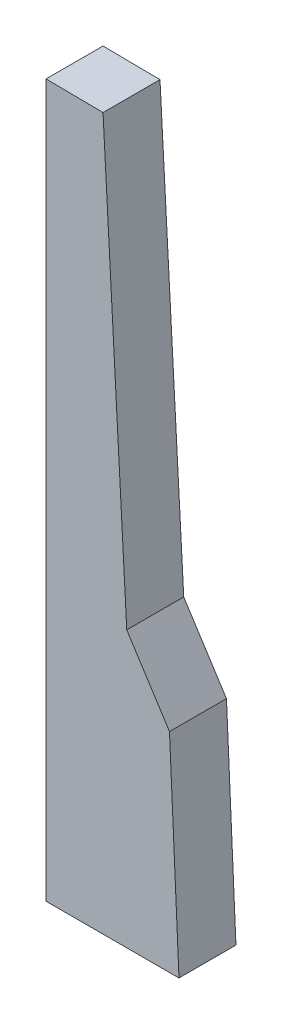
ISO-10303-21;
HEADER;
FILE_DESCRIPTION(('STEP AP214'),'2;1');
FILE_NAME('part.step','',(''),(''),'','','');
FILE_SCHEMA(('AUTOMOTIVE_DESIGN { 1 0 10303 214 1 1 1 1 }'));
ENDSEC;
DATA;
#1=APPLICATION_CONTEXT('core data for automotive mechanical design processes');
#2=APPLICATION_PROTOCOL_DEFINITION('international standard','automotive_design',2000,#1);
#3=PRODUCT_CONTEXT('',#1,'mechanical');
#4=PRODUCT('Part','Part','',(#3));
#5=PRODUCT_RELATED_PRODUCT_CATEGORY('part','',(#4));
#6=PRODUCT_DEFINITION_FORMATION('','',#4);
#7=PRODUCT_DEFINITION_CONTEXT('part definition',#1,'design');
#8=PRODUCT_DEFINITION('design','',#6,#7);
#9=PRODUCT_DEFINITION_SHAPE('','',#8);
#10=(LENGTH_UNIT() NAMED_UNIT(*) SI_UNIT(.MILLI.,.METRE.));
#11=(NAMED_UNIT(*) PLANE_ANGLE_UNIT() SI_UNIT($,.RADIAN.));
#12=(NAMED_UNIT(*) SI_UNIT($,.STERADIAN.) SOLID_ANGLE_UNIT());
#13=UNCERTAINTY_MEASURE_WITH_UNIT(LENGTH_MEASURE(1.E-05),#10,'distance_accuracy_value','');
#14=(GEOMETRIC_REPRESENTATION_CONTEXT(3) GLOBAL_UNCERTAINTY_ASSIGNED_CONTEXT((#13)) GLOBAL_UNIT_ASSIGNED_CONTEXT((#10,
#11,#12)) REPRESENTATION_CONTEXT('',''));
#15=CARTESIAN_POINT('',(0.,0.,0.));
#16=DIRECTION('',(0.,0.,1.));
#17=DIRECTION('',(1.,0.,0.));
#18=AXIS2_PLACEMENT_3D('',#15,#16,#17);
#19=CARTESIAN_POINT('',(14.,0.,6.));
#20=DIRECTION('',(0.,1.,0.));
#21=DIRECTION('',(-1.,0.,0.));
#22=AXIS2_PLACEMENT_3D('',#19,#20,#21);
#23=PLANE('',#22);
#24=DIRECTION('',(1.,0.,0.));
#25=VECTOR('',#24,1.);
#26=CARTESIAN_POINT('',(14.,0.,0.));
#27=LINE('',#26,#25);
#28=CARTESIAN_POINT('',(0.,0.,0.));
#29=VERTEX_POINT('',#28);
#30=CARTESIAN_POINT('',(14.,0.,0.));
#31=VERTEX_POINT('',#30);
#32=EDGE_CURVE('E117',#29,#31,#27,.T.);
#33=ORIENTED_EDGE('',*,*,#32,.T.);
#34=DIRECTION('',(0.,0.,-1.));
#35=VECTOR('',#34,1.);
#36=CARTESIAN_POINT('',(14.,0.,6.));
#37=LINE('',#36,#35);
#38=CARTESIAN_POINT('',(14.,0.,6.));
#39=VERTEX_POINT('',#38);
#40=EDGE_CURVE('E11',#39,#31,#37,.T.);
#41=ORIENTED_EDGE('',*,*,#40,.F.);
#42=DIRECTION('',(1.,0.,0.));
#43=VECTOR('',#42,1.);
#44=CARTESIAN_POINT('',(14.,0.,6.));
#45=LINE('',#44,#43);
#46=CARTESIAN_POINT('',(0.,0.,6.));
#47=VERTEX_POINT('',#46);
#48=EDGE_CURVE('E127',#47,#39,#45,.T.);
#49=ORIENTED_EDGE('',*,*,#48,.F.);
#50=DIRECTION('',(0.,0.,-1.));
#51=VECTOR('',#50,1.);
#52=CARTESIAN_POINT('',(0.,0.,6.));
#53=LINE('',#52,#51);
#54=EDGE_CURVE('E113',#47,#29,#53,.T.);
#55=ORIENTED_EDGE('',*,*,#54,.T.);
#56=EDGE_LOOP('',(#33,#41,#49,#55));
#57=FACE_BOUND('',#56,.T.);
#58=ADVANCED_FACE('F33',(#57),#23,.F.);
#59=CARTESIAN_POINT('',(13.,21.9772609758359,6.));
#60=DIRECTION('',(-0.998966407992541,-0.0454545454545454,0.));
#61=DIRECTION('',(0.0454545454545454,-0.998966407992542,0.));
#62=AXIS2_PLACEMENT_3D('',#59,#60,#61);
#63=PLANE('',#62);
#64=DIRECTION('',(-0.0454545454545454,0.998966407992541,0.));
#65=VECTOR('',#64,1.);
#66=CARTESIAN_POINT('',(13.,21.9772609758359,0.));
#67=LINE('',#66,#65);
#68=CARTESIAN_POINT('',(13.,21.9772609758359,0.));
#69=VERTEX_POINT('',#68);
#70=EDGE_CURVE('E120',#31,#69,#67,.T.);
#71=ORIENTED_EDGE('',*,*,#70,.T.);
#72=DIRECTION('',(0.,0.,-1.));
#73=VECTOR('',#72,1.);
#74=CARTESIAN_POINT('',(13.,21.9772609758359,6.));
#75=LINE('',#74,#73);
#76=CARTESIAN_POINT('',(13.,21.9772609758359,6.));
#77=VERTEX_POINT('',#76);
#78=EDGE_CURVE('E41',#77,#69,#75,.T.);
#79=ORIENTED_EDGE('',*,*,#78,.F.);
#80=DIRECTION('',(-0.0454545454545454,0.998966407992541,0.));
#81=VECTOR('',#80,1.);
#82=CARTESIAN_POINT('',(13.,21.9772609758359,6.));
#83=LINE('',#82,#81);
#84=EDGE_CURVE('E86',#39,#77,#83,.T.);
#85=ORIENTED_EDGE('',*,*,#84,.F.);
#86=ORIENTED_EDGE('',*,*,#40,.T.);
#87=EDGE_LOOP('',(#71,#79,#85,#86));
#88=FACE_BOUND('',#87,.T.);
#89=ADVANCED_FACE('F151',(#88),#63,.F.);
#90=CARTESIAN_POINT('',(8.5,29.,6.));
#91=DIRECTION('',(-0.841974765554444,-0.539516908140551,0.));
#92=DIRECTION('',(0.539516908140551,-0.841974765554444,0.));
#93=AXIS2_PLACEMENT_3D('',#90,#91,#92);
#94=PLANE('',#93);
#95=DIRECTION('',(-0.539516908140551,0.841974765554444,0.));
#96=VECTOR('',#95,1.);
#97=CARTESIAN_POINT('',(8.5,29.,0.));
#98=LINE('',#97,#96);
#99=CARTESIAN_POINT('',(8.5,29.,0.));
#100=VERTEX_POINT('',#99);
#101=EDGE_CURVE('E122',#69,#100,#98,.T.);
#102=ORIENTED_EDGE('',*,*,#101,.T.);
#103=DIRECTION('',(0.,0.,-1.));
#104=VECTOR('',#103,1.);
#105=CARTESIAN_POINT('',(8.5,29.,6.));
#106=LINE('',#105,#104);
#107=CARTESIAN_POINT('',(8.5,29.,6.));
#108=VERTEX_POINT('',#107);
#109=EDGE_CURVE('E108',#108,#100,#106,.T.);
#110=ORIENTED_EDGE('',*,*,#109,.F.);
#111=DIRECTION('',(-0.539516908140551,0.841974765554444,0.));
#112=VECTOR('',#111,1.);
#113=CARTESIAN_POINT('',(8.5,29.,6.));
#114=LINE('',#113,#112);
#115=EDGE_CURVE('E99',#77,#108,#114,.T.);
#116=ORIENTED_EDGE('',*,*,#115,.F.);
#117=ORIENTED_EDGE('',*,*,#78,.T.);
#118=EDGE_LOOP('',(#102,#110,#116,#117));
#119=FACE_BOUND('',#118,.T.);
#120=ADVANCED_FACE('F133',(#119),#94,.F.);
#121=CARTESIAN_POINT('',(5.99961458628093,74.9319939996388,6.));
#122=DIRECTION('',(-0.998521608687801,-0.0543562046460668,0.));
#123=DIRECTION('',(0.0543562046460668,-0.998521608687802,0.));
#124=AXIS2_PLACEMENT_3D('',#121,#122,#123);
#125=PLANE('',#124);
#126=DIRECTION('',(-0.0543562046460668,0.998521608687802,0.));
#127=VECTOR('',#126,1.);
#128=CARTESIAN_POINT('',(5.99961458628093,74.9319939996388,0.));
#129=LINE('',#128,#127);
#130=CARTESIAN_POINT('',(5.99961458628093,74.9319939996388,0.));
#131=VERTEX_POINT('',#130);
#132=EDGE_CURVE('E107',#100,#131,#129,.T.);
#133=ORIENTED_EDGE('',*,*,#132,.T.);
#134=DIRECTION('',(0.,0.,-1.));
#135=VECTOR('',#134,1.);
#136=CARTESIAN_POINT('',(5.99961458628093,74.9319939996388,6.));
#137=LINE('',#136,#135);
#138=CARTESIAN_POINT('',(5.99961458628093,74.9319939996388,6.));
#139=VERTEX_POINT('',#138);
#140=EDGE_CURVE('E104',#139,#131,#137,.T.);
#141=ORIENTED_EDGE('',*,*,#140,.F.);
#142=DIRECTION('',(-0.0543562046460668,0.998521608687802,0.));
#143=VECTOR('',#142,1.);
#144=CARTESIAN_POINT('',(5.99961458628093,74.9319939996388,6.));
#145=LINE('',#144,#143);
#146=EDGE_CURVE('E93',#108,#139,#145,.T.);
#147=ORIENTED_EDGE('',*,*,#146,.F.);
#148=ORIENTED_EDGE('',*,*,#109,.T.);
#149=EDGE_LOOP('',(#133,#141,#147,#148));
#150=FACE_BOUND('',#149,.T.);
#151=ADVANCED_FACE('F105',(#150),#125,.F.);
#152=CARTESIAN_POINT('',(0.,75.,6.));
#153=DIRECTION('',(-0.0113343333935252,-0.999935764380155,0.));
#154=DIRECTION('',(0.999935764380155,-0.0113343333935252,0.));
#155=AXIS2_PLACEMENT_3D('',#152,#153,#154);
#156=PLANE('',#155);
#157=DIRECTION('',(-0.999935764380155,0.0113343333935252,0.));
#158=VECTOR('',#157,1.);
#159=CARTESIAN_POINT('',(0.,75.,0.));
#160=LINE('',#159,#158);
#161=CARTESIAN_POINT('',(0.,75.,0.));
#162=VERTEX_POINT('',#161);
#163=EDGE_CURVE('E72',#131,#162,#160,.T.);
#164=ORIENTED_EDGE('',*,*,#163,.T.);
#165=DIRECTION('',(0.,0.,-1.));
#166=VECTOR('',#165,1.);
#167=CARTESIAN_POINT('',(0.,75.,6.));
#168=LINE('',#167,#166);
#169=CARTESIAN_POINT('',(0.,75.,6.));
#170=VERTEX_POINT('',#169);
#171=EDGE_CURVE('E109',#170,#162,#168,.T.);
#172=ORIENTED_EDGE('',*,*,#171,.F.);
#173=DIRECTION('',(-0.999935764380155,0.0113343333935252,0.));
#174=VECTOR('',#173,1.);
#175=CARTESIAN_POINT('',(0.,75.,6.));
#176=LINE('',#175,#174);
#177=EDGE_CURVE('E97',#139,#170,#176,.T.);
#178=ORIENTED_EDGE('',*,*,#177,.F.);
#179=ORIENTED_EDGE('',*,*,#140,.T.);
#180=EDGE_LOOP('',(#164,#172,#178,#179));
#181=FACE_BOUND('',#180,.T.);
#182=ADVANCED_FACE('F111',(#181),#156,.F.);
#183=CARTESIAN_POINT('',(0.,0.,6.));
#184=DIRECTION('',(1.,0.,0.));
#185=DIRECTION('',(0.,0.,-1.));
#186=AXIS2_PLACEMENT_3D('',#183,#184,#185);
#187=PLANE('',#186);
#188=DIRECTION('',(0.,-1.,0.));
#189=VECTOR('',#188,1.);
#190=CARTESIAN_POINT('',(0.,0.,0.));
#191=LINE('',#190,#189);
#192=EDGE_CURVE('E78',#162,#29,#191,.T.);
#193=ORIENTED_EDGE('',*,*,#192,.T.);
#194=ORIENTED_EDGE('',*,*,#54,.F.);
#195=DIRECTION('',(0.,-1.,0.));
#196=VECTOR('',#195,1.);
#197=CARTESIAN_POINT('',(0.,0.,6.));
#198=LINE('',#197,#196);
#199=EDGE_CURVE('E49',#170,#47,#198,.T.);
#200=ORIENTED_EDGE('',*,*,#199,.F.);
#201=ORIENTED_EDGE('',*,*,#171,.T.);
#202=EDGE_LOOP('',(#193,#194,#200,#201));
#203=FACE_BOUND('',#202,.T.);
#204=ADVANCED_FACE('F140',(#203),#187,.F.);
#205=CARTESIAN_POINT('',(0.,0.,6.));
#206=DIRECTION('',(0.,0.,-1.));
#207=DIRECTION('',(-1.,0.,0.));
#208=AXIS2_PLACEMENT_3D('',#205,#206,#207);
#209=PLANE('',#208);
#210=ORIENTED_EDGE('',*,*,#48,.T.);
#211=ORIENTED_EDGE('',*,*,#84,.T.);
#212=ORIENTED_EDGE('',*,*,#115,.T.);
#213=ORIENTED_EDGE('',*,*,#146,.T.);
#214=ORIENTED_EDGE('',*,*,#177,.T.);
#215=ORIENTED_EDGE('',*,*,#199,.T.);
#216=EDGE_LOOP('',(#210,#211,#212,#213,#214,#215));
#217=FACE_BOUND('',#216,.T.);
#218=ADVANCED_FACE('F95',(#217),#209,.F.);
#219=CARTESIAN_POINT('',(0.,0.,0.));
#220=DIRECTION('',(0.,0.,-1.));
#221=DIRECTION('',(-1.,0.,0.));
#222=AXIS2_PLACEMENT_3D('',#219,#220,#221);
#223=PLANE('',#222);
#224=ORIENTED_EDGE('',*,*,#32,.F.);
#225=ORIENTED_EDGE('',*,*,#192,.F.);
#226=ORIENTED_EDGE('',*,*,#163,.F.);
#227=ORIENTED_EDGE('',*,*,#132,.F.);
#228=ORIENTED_EDGE('',*,*,#101,.F.);
#229=ORIENTED_EDGE('',*,*,#70,.F.);
#230=EDGE_LOOP('',(#224,#225,#226,#227,#228,#229));
#231=FACE_BOUND('',#230,.T.);
#232=ADVANCED_FACE('F136',(#231),#223,.T.);
#233=CLOSED_SHELL('',(#58,#89,#120,#151,#182,#204,#218,#232));
#234=MANIFOLD_SOLID_BREP('B2',#233);
#235=ADVANCED_BREP_SHAPE_REPRESENTATION('',(#18,#234),#14);
#236=SHAPE_DEFINITION_REPRESENTATION(#9,#235);
ENDSEC;
END-ISO-10303-21;
